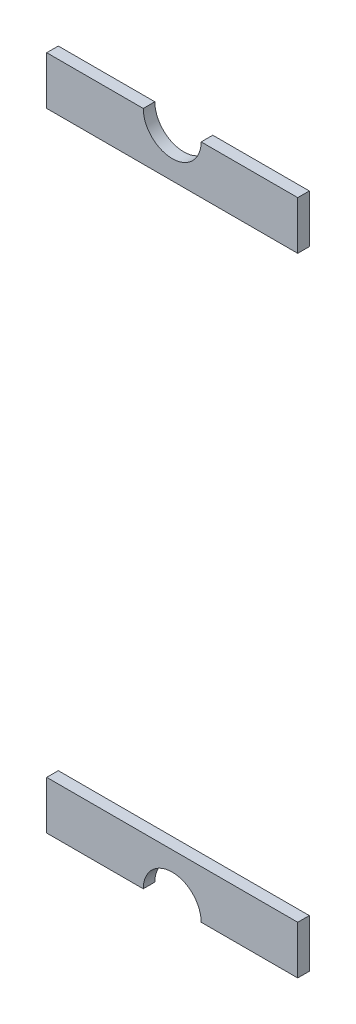
ISO-10303-21;
HEADER;
FILE_DESCRIPTION(('STEP AP214'),'2;1');
FILE_NAME('part.step','',(''),(''),'','','');
FILE_SCHEMA(('AUTOMOTIVE_DESIGN { 1 0 10303 214 1 1 1 1 }'));
ENDSEC;
DATA;
#1=APPLICATION_CONTEXT('core data for automotive mechanical design processes');
#2=APPLICATION_PROTOCOL_DEFINITION('international standard','automotive_design',2000,#1);
#3=PRODUCT_CONTEXT('',#1,'mechanical');
#4=PRODUCT('Part','Part','',(#3));
#5=PRODUCT_RELATED_PRODUCT_CATEGORY('part','',(#4));
#6=PRODUCT_DEFINITION_FORMATION('','',#4);
#7=PRODUCT_DEFINITION_CONTEXT('part definition',#1,'design');
#8=PRODUCT_DEFINITION('design','',#6,#7);
#9=PRODUCT_DEFINITION_SHAPE('','',#8);
#10=(LENGTH_UNIT() NAMED_UNIT(*) SI_UNIT(.MILLI.,.METRE.));
#11=(NAMED_UNIT(*) PLANE_ANGLE_UNIT() SI_UNIT($,.RADIAN.));
#12=(NAMED_UNIT(*) SI_UNIT($,.STERADIAN.) SOLID_ANGLE_UNIT());
#13=UNCERTAINTY_MEASURE_WITH_UNIT(LENGTH_MEASURE(1.E-05),#10,'distance_accuracy_value','');
#14=(GEOMETRIC_REPRESENTATION_CONTEXT(3) GLOBAL_UNCERTAINTY_ASSIGNED_CONTEXT((#13)) GLOBAL_UNIT_ASSIGNED_CONTEXT((#10,
#11,#12)) REPRESENTATION_CONTEXT('',''));
#15=CARTESIAN_POINT('',(0.,0.,0.));
#16=DIRECTION('',(0.,0.,1.));
#17=DIRECTION('',(1.,0.,0.));
#18=AXIS2_PLACEMENT_3D('',#15,#16,#17);
#19=CARTESIAN_POINT('',(-13.50000067937,19.12499934,0.12));
#20=DIRECTION('',(0.,0.,1.));
#21=DIRECTION('',(1.,0.,0.));
#22=AXIS2_PLACEMENT_3D('',#19,#20,#21);
#23=PLANE('',#22);
#24=DIRECTION('',(-1.,-1.19248806385E-08,0.));
#25=VECTOR('',#24,1.);
#26=CARTESIAN_POINT('',(-12.85000068086,19.249999347751,0.12));
#27=LINE('',#26,#25);
#28=CARTESIAN_POINT('',(-13.35000068086,19.2499993408943,0.12));
#29=VERTEX_POINT('',#28);
#30=CARTESIAN_POINT('',(-12.8500006808604,19.249999347751,0.12));
#31=VERTEX_POINT('',#30);
#32=EDGE_CURVE('P0_E48',#29,#31,#27,.F.);
#33=ORIENTED_EDGE('',*,*,#32,.F.);
#34=CARTESIAN_POINT('',(-13.50000068086,19.24999934,0.12));
#35=DIRECTION('',(0.,0.,1.));
#36=DIRECTION('',(1.,0.,0.));
#37=AXIS2_PLACEMENT_3D('',#34,#35,#36);
#38=CIRCLE('',#37,0.15);
#39=CARTESIAN_POINT('',(-13.65000068086,19.249999338211,0.12));
#40=VERTEX_POINT('',#39);
#41=EDGE_CURVE('P0_E20',#29,#40,#38,.F.);
#42=ORIENTED_EDGE('',*,*,#41,.T.);
#43=DIRECTION('',(-1.,-1.19248806385E-08,0.));
#44=VECTOR('',#43,1.);
#45=CARTESIAN_POINT('',(-13.65000068086,19.249999338211,0.12));
#46=LINE('',#45,#44);
#47=CARTESIAN_POINT('',(-14.15000068086,19.2499993322487,0.12));
#48=VERTEX_POINT('',#47);
#49=EDGE_CURVE('P0_E83',#48,#40,#46,.F.);
#50=ORIENTED_EDGE('',*,*,#49,.F.);
#51=DIRECTION('',(1.19248806385E-08,-1.,0.));
#52=VECTOR('',#51,1.);
#53=CARTESIAN_POINT('',(-14.15000068086,19.249999332249,0.12));
#54=LINE('',#53,#52);
#55=CARTESIAN_POINT('',(-14.1500006778796,18.999999332249,0.12));
#56=VERTEX_POINT('',#55);
#57=EDGE_CURVE('P0_E80',#56,#48,#54,.F.);
#58=ORIENTED_EDGE('',*,*,#57,.F.);
#59=DIRECTION('',(1.,1.19248806385E-08,0.));
#60=VECTOR('',#59,1.);
#61=CARTESIAN_POINT('',(-14.15000067788,18.999999332249,0.12));
#62=LINE('',#61,#60);
#63=CARTESIAN_POINT('',(-12.85000067788,18.9999993477511,0.12));
#64=VERTEX_POINT('',#63);
#65=EDGE_CURVE('P0_E71',#64,#56,#62,.F.);
#66=ORIENTED_EDGE('',*,*,#65,.F.);
#67=DIRECTION('',(-1.19248806385E-08,1.,0.));
#68=VECTOR('',#67,1.);
#69=CARTESIAN_POINT('',(-12.85000067788,18.999999347751,0.12));
#70=LINE('',#69,#68);
#71=EDGE_CURVE('P0_E92',#31,#64,#70,.F.);
#72=ORIENTED_EDGE('',*,*,#71,.F.);
#73=EDGE_LOOP('',(#33,#42,#50,#58,#66,#72));
#74=FACE_BOUND('',#73,.T.);
#75=ADVANCED_FACE('P0_F17',(#74),#23,.T.);
#76=CARTESIAN_POINT('',(-14.15000068086,19.249999332249,0.));
#77=DIRECTION('',(-1.,-1.19248806385E-08,0.));
#78=DIRECTION('',(1.19248806385E-08,-1.,0.));
#79=AXIS2_PLACEMENT_3D('',#76,#77,#78);
#80=PLANE('',#79);
#81=ORIENTED_EDGE('',*,*,#57,.T.);
#82=DIRECTION('',(0.,0.,1.));
#83=VECTOR('',#82,1.);
#84=CARTESIAN_POINT('',(-14.15000068086,19.2499993322486,0.));
#85=LINE('',#84,#83);
#86=CARTESIAN_POINT('',(-14.15000068086,19.2499993362235,0.06));
#87=VERTEX_POINT('',#86);
#88=EDGE_CURVE('P0_E102',#87,#48,#85,.T.);
#89=ORIENTED_EDGE('',*,*,#88,.F.);
#90=DIRECTION('',(0.,1.,0.));
#91=VECTOR('',#90,1.);
#92=CARTESIAN_POINT('',(-14.15000068086,19.12499934,0.06));
#93=LINE('',#92,#91);
#94=CARTESIAN_POINT('',(-14.1500006798667,18.999999332249,0.06));
#95=VERTEX_POINT('',#94);
#96=EDGE_CURVE('P0_E91',#87,#95,#93,.F.);
#97=ORIENTED_EDGE('',*,*,#96,.T.);
#98=DIRECTION('',(0.,0.,1.));
#99=VECTOR('',#98,1.);
#100=CARTESIAN_POINT('',(-14.15000067788,18.999999332249,0.));
#101=LINE('',#100,#99);
#102=EDGE_CURVE('P0_E76',#56,#95,#101,.F.);
#103=ORIENTED_EDGE('',*,*,#102,.F.);
#104=EDGE_LOOP('',(#81,#89,#97,#103));
#105=FACE_BOUND('',#104,.T.);
#106=ADVANCED_FACE('P0_F89',(#105),#80,.T.);
#107=CARTESIAN_POINT('',(-14.15000067788,18.999999332249,0.));
#108=DIRECTION('',(1.19248806385E-08,-1.,0.));
#109=DIRECTION('',(1.,1.19248806385E-08,0.));
#110=AXIS2_PLACEMENT_3D('',#107,#108,#109);
#111=PLANE('',#110);
#112=ORIENTED_EDGE('',*,*,#65,.T.);
#113=ORIENTED_EDGE('',*,*,#102,.T.);
#114=DIRECTION('',(1.,0.,0.));
#115=VECTOR('',#114,1.);
#116=CARTESIAN_POINT('',(-13.50000067937,18.999999332249,0.06));
#117=LINE('',#116,#115);
#118=CARTESIAN_POINT('',(-12.85000067788,18.9999993374163,0.06));
#119=VERTEX_POINT('',#118);
#120=EDGE_CURVE('P0_E123',#95,#119,#117,.T.);
#121=ORIENTED_EDGE('',*,*,#120,.T.);
#122=DIRECTION('',(0.,0.,1.));
#123=VECTOR('',#122,1.);
#124=CARTESIAN_POINT('',(-12.85000067788,18.999999347751,0.));
#125=LINE('',#124,#123);
#126=EDGE_CURVE('P0_E79',#64,#119,#125,.F.);
#127=ORIENTED_EDGE('',*,*,#126,.F.);
#128=EDGE_LOOP('',(#112,#113,#121,#127));
#129=FACE_BOUND('',#128,.T.);
#130=ADVANCED_FACE('P0_F73',(#129),#111,.T.);
#131=CARTESIAN_POINT('',(-12.85000067788,18.999999347751,0.));
#132=DIRECTION('',(1.,1.19248806385E-08,0.));
#133=DIRECTION('',(-1.19248806385E-08,1.,0.));
#134=AXIS2_PLACEMENT_3D('',#131,#132,#133);
#135=PLANE('',#134);
#136=ORIENTED_EDGE('',*,*,#71,.T.);
#137=ORIENTED_EDGE('',*,*,#126,.T.);
#138=DIRECTION('',(0.,1.,0.));
#139=VECTOR('',#138,1.);
#140=CARTESIAN_POINT('',(-12.85000067788,19.12499934,0.06));
#141=LINE('',#140,#139);
#142=CARTESIAN_POINT('',(-12.8500006788733,19.249999347751,0.06));
#143=VERTEX_POINT('',#142);
#144=EDGE_CURVE('P0_E119',#119,#143,#141,.T.);
#145=ORIENTED_EDGE('',*,*,#144,.T.);
#146=DIRECTION('',(0.,0.,1.));
#147=VECTOR('',#146,1.);
#148=CARTESIAN_POINT('',(-12.85000068086,19.249999347751,0.));
#149=LINE('',#148,#147);
#150=EDGE_CURVE('P0_E108',#31,#143,#149,.F.);
#151=ORIENTED_EDGE('',*,*,#150,.F.);
#152=EDGE_LOOP('',(#136,#137,#145,#151));
#153=FACE_BOUND('',#152,.T.);
#154=ADVANCED_FACE('P0_F151',(#153),#135,.T.);
#155=CARTESIAN_POINT('',(-12.85000068086,19.249999347751,0.));
#156=DIRECTION('',(-1.19248806385E-08,1.,0.));
#157=DIRECTION('',(-1.,-1.19248806385E-08,0.));
#158=AXIS2_PLACEMENT_3D('',#155,#156,#157);
#159=PLANE('',#158);
#160=ORIENTED_EDGE('',*,*,#32,.T.);
#161=ORIENTED_EDGE('',*,*,#150,.T.);
#162=DIRECTION('',(1.,0.,0.));
#163=VECTOR('',#162,1.);
#164=CARTESIAN_POINT('',(-13.50000067937,19.249999347751,0.06));
#165=LINE('',#164,#163);
#166=CARTESIAN_POINT('',(-13.35000068086,19.2499993438755,0.06));
#167=VERTEX_POINT('',#166);
#168=EDGE_CURVE('P0_E115',#143,#167,#165,.F.);
#169=ORIENTED_EDGE('',*,*,#168,.T.);
#170=DIRECTION('',(0.,0.,1.));
#171=VECTOR('',#170,1.);
#172=CARTESIAN_POINT('',(-13.35000068086,19.24999934,0.));
#173=LINE('',#172,#171);
#174=EDGE_CURVE('P0_E137',#167,#29,#173,.T.);
#175=ORIENTED_EDGE('',*,*,#174,.T.);
#176=EDGE_LOOP('',(#160,#161,#169,#175));
#177=FACE_BOUND('',#176,.T.);
#178=ADVANCED_FACE('P0_F156',(#177),#159,.T.);
#179=CARTESIAN_POINT('',(-13.50000068086,19.24999934,0.));
#180=DIRECTION('',(0.,0.,1.));
#181=DIRECTION('',(1.,0.,0.));
#182=AXIS2_PLACEMENT_3D('',#179,#180,#181);
#183=CYLINDRICAL_SURFACE('',#182,0.15);
#184=DIRECTION('',(0.,0.,1.));
#185=VECTOR('',#184,1.);
#186=CARTESIAN_POINT('',(-13.65000068086,19.249999338211,0.));
#187=LINE('',#186,#185);
#188=CARTESIAN_POINT('',(-13.65000068086,19.249999338211,0.06));
#189=VERTEX_POINT('',#188);
#190=EDGE_CURVE('P0_E34',#40,#189,#187,.F.);
#191=ORIENTED_EDGE('',*,*,#190,.F.);
#192=ORIENTED_EDGE('',*,*,#41,.F.);
#193=ORIENTED_EDGE('',*,*,#174,.F.);
#194=CARTESIAN_POINT('',(-13.50000068086,19.24999934,0.06));
#195=DIRECTION('',(0.,0.,1.));
#196=DIRECTION('',(1.,0.,0.));
#197=AXIS2_PLACEMENT_3D('',#194,#195,#196);
#198=CIRCLE('',#197,0.15);
#199=EDGE_CURVE('P0_E26',#167,#189,#198,.F.);
#200=ORIENTED_EDGE('',*,*,#199,.T.);
#201=EDGE_LOOP('',(#191,#192,#193,#200));
#202=FACE_BOUND('',#201,.T.);
#203=ADVANCED_FACE('P0_F154',(#202),#183,.F.);
#204=CARTESIAN_POINT('',(-13.65000068086,19.249999338211,0.));
#205=DIRECTION('',(-1.19248806385E-08,1.,0.));
#206=DIRECTION('',(-1.,-1.19248806385E-08,0.));
#207=AXIS2_PLACEMENT_3D('',#204,#205,#206);
#208=PLANE('',#207);
#209=ORIENTED_EDGE('',*,*,#49,.T.);
#210=ORIENTED_EDGE('',*,*,#190,.T.);
#211=DIRECTION('',(1.,0.,0.));
#212=VECTOR('',#211,1.);
#213=CARTESIAN_POINT('',(-13.50000067937,19.249999338211,0.06));
#214=LINE('',#213,#212);
#215=EDGE_CURVE('P0_E11',#189,#87,#214,.F.);
#216=ORIENTED_EDGE('',*,*,#215,.T.);
#217=ORIENTED_EDGE('',*,*,#88,.T.);
#218=EDGE_LOOP('',(#209,#210,#216,#217));
#219=FACE_BOUND('',#218,.T.);
#220=ADVANCED_FACE('P0_F153',(#219),#208,.T.);
#221=CARTESIAN_POINT('',(-13.50000067937,19.12499934,0.06));
#222=DIRECTION('',(0.,0.,1.));
#223=DIRECTION('',(1.,0.,0.));
#224=AXIS2_PLACEMENT_3D('',#221,#222,#223);
#225=PLANE('',#224);
#226=ORIENTED_EDGE('',*,*,#199,.F.);
#227=ORIENTED_EDGE('',*,*,#168,.F.);
#228=ORIENTED_EDGE('',*,*,#144,.F.);
#229=ORIENTED_EDGE('',*,*,#120,.F.);
#230=ORIENTED_EDGE('',*,*,#96,.F.);
#231=ORIENTED_EDGE('',*,*,#215,.F.);
#232=EDGE_LOOP('',(#226,#227,#228,#229,#230,#231));
#233=FACE_BOUND('',#232,.T.);
#234=ADVANCED_FACE('P0_F148',(#233),#225,.F.);
#235=CLOSED_SHELL('',(#75,#106,#130,#154,#178,#203,#220,#234));
#236=MANIFOLD_SOLID_BREP('P0_B1',#235);
#237=CARTESIAN_POINT('',(-13.50000064062,15.87499934,0.06));
#238=DIRECTION('',(0.,0.,1.));
#239=DIRECTION('',(1.,0.,0.));
#240=AXIS2_PLACEMENT_3D('',#237,#238,#239);
#241=PLANE('',#240);
#242=CARTESIAN_POINT('',(-13.50000063913,15.74999934,0.06));
#243=DIRECTION('',(0.,0.,1.));
#244=DIRECTION('',(1.,0.,0.));
#245=AXIS2_PLACEMENT_3D('',#242,#243,#244);
#246=CIRCLE('',#245,0.15);
#247=CARTESIAN_POINT('',(-13.35000063913,15.7499993408945,0.06));
#248=VERTEX_POINT('',#247);
#249=CARTESIAN_POINT('',(-13.65000063913,15.7499993382112,0.06));
#250=VERTEX_POINT('',#249);
#251=EDGE_CURVE('P1_E20',#248,#250,#246,.T.);
#252=ORIENTED_EDGE('',*,*,#251,.T.);
#253=DIRECTION('',(1.,1.19248806385E-08,0.));
#254=VECTOR('',#253,1.);
#255=CARTESIAN_POINT('',(-14.15000063913,15.749999332249,0.06));
#256=LINE('',#255,#254);
#257=CARTESIAN_POINT('',(-14.1500006391296,15.749999332249,0.06));
#258=VERTEX_POINT('',#257);
#259=EDGE_CURVE('P1_E57',#258,#250,#256,.T.);
#260=ORIENTED_EDGE('',*,*,#259,.F.);
#261=DIRECTION('',(1.19248806385E-08,-1.,0.));
#262=VECTOR('',#261,1.);
#263=CARTESIAN_POINT('',(-14.15000064211,15.999999332249,0.06));
#264=LINE('',#263,#262);
#265=CARTESIAN_POINT('',(-14.15000064211,15.9999993322489,0.06));
#266=VERTEX_POINT('',#265);
#267=EDGE_CURVE('P1_E107',#266,#258,#264,.T.);
#268=ORIENTED_EDGE('',*,*,#267,.F.);
#269=DIRECTION('',(-1.,-1.19248806385E-08,0.));
#270=VECTOR('',#269,1.);
#271=CARTESIAN_POINT('',(-12.85000064211,15.999999347751,0.06));
#272=LINE('',#271,#270);
#273=CARTESIAN_POINT('',(-12.8500006421104,15.999999347751,0.06));
#274=VERTEX_POINT('',#273);
#275=EDGE_CURVE('P1_E72',#274,#266,#272,.T.);
#276=ORIENTED_EDGE('',*,*,#275,.F.);
#277=DIRECTION('',(-1.19248806385E-08,1.,0.));
#278=VECTOR('',#277,1.);
#279=CARTESIAN_POINT('',(-12.85000063913,15.749999347751,0.06));
#280=LINE('',#279,#278);
#281=CARTESIAN_POINT('',(-12.85000063913,15.7499993477511,0.06));
#282=VERTEX_POINT('',#281);
#283=EDGE_CURVE('P1_E74',#282,#274,#280,.T.);
#284=ORIENTED_EDGE('',*,*,#283,.F.);
#285=DIRECTION('',(1.,1.19248806385E-08,0.));
#286=VECTOR('',#285,1.);
#287=CARTESIAN_POINT('',(-13.35000063913,15.749999341789,0.06));
#288=LINE('',#287,#286);
#289=EDGE_CURVE('P1_E52',#248,#282,#288,.T.);
#290=ORIENTED_EDGE('',*,*,#289,.F.);
#291=EDGE_LOOP('',(#252,#260,#268,#276,#284,#290));
#292=FACE_BOUND('',#291,.T.);
#293=ADVANCED_FACE('P1_F17',(#292),#241,.F.);
#294=CARTESIAN_POINT('',(-13.35000063913,15.749999341789,0.));
#295=DIRECTION('',(1.19248806385E-08,-1.,0.));
#296=DIRECTION('',(1.,1.19248806385E-08,0.));
#297=AXIS2_PLACEMENT_3D('',#294,#295,#296);
#298=PLANE('',#297);
#299=DIRECTION('',(1.,0.,0.));
#300=VECTOR('',#299,1.);
#301=CARTESIAN_POINT('',(-13.50000064062,15.749999341789,0.12));
#302=LINE('',#301,#300);
#303=CARTESIAN_POINT('',(-13.35000063913,15.7499993408945,0.12));
#304=VERTEX_POINT('',#303);
#305=CARTESIAN_POINT('',(-12.85000063913,15.7499993437763,0.12));
#306=VERTEX_POINT('',#305);
#307=EDGE_CURVE('P1_E126',#304,#306,#302,.T.);
#308=ORIENTED_EDGE('',*,*,#307,.F.);
#309=DIRECTION('',(0.,0.,1.));
#310=VECTOR('',#309,1.);
#311=CARTESIAN_POINT('',(-13.35000063913,15.74999934,0.));
#312=LINE('',#311,#310);
#313=EDGE_CURVE('P1_E84',#304,#248,#312,.F.);
#314=ORIENTED_EDGE('',*,*,#313,.T.);
#315=ORIENTED_EDGE('',*,*,#289,.T.);
#316=DIRECTION('',(0.,0.,1.));
#317=VECTOR('',#316,1.);
#318=CARTESIAN_POINT('',(-12.85000063913,15.749999347751,0.));
#319=LINE('',#318,#317);
#320=EDGE_CURVE('P1_E78',#306,#282,#319,.F.);
#321=ORIENTED_EDGE('',*,*,#320,.F.);
#322=EDGE_LOOP('',(#308,#314,#315,#321));
#323=FACE_BOUND('',#322,.T.);
#324=ADVANCED_FACE('P1_F81',(#323),#298,.T.);
#325=CARTESIAN_POINT('',(-12.85000063913,15.749999347751,0.));
#326=DIRECTION('',(1.,1.19248806385E-08,0.));
#327=DIRECTION('',(-1.19248806385E-08,1.,0.));
#328=AXIS2_PLACEMENT_3D('',#325,#326,#327);
#329=PLANE('',#328);
#330=DIRECTION('',(0.,1.,0.));
#331=VECTOR('',#330,1.);
#332=CARTESIAN_POINT('',(-12.85000063913,15.87499934,0.12));
#333=LINE('',#332,#331);
#334=CARTESIAN_POINT('',(-12.8500006401233,15.999999347751,0.12));
#335=VERTEX_POINT('',#334);
#336=EDGE_CURVE('P1_E89',#306,#335,#333,.T.);
#337=ORIENTED_EDGE('',*,*,#336,.F.);
#338=ORIENTED_EDGE('',*,*,#320,.T.);
#339=ORIENTED_EDGE('',*,*,#283,.T.);
#340=DIRECTION('',(0.,0.,1.));
#341=VECTOR('',#340,1.);
#342=CARTESIAN_POINT('',(-12.85000064211,15.999999347751,0.));
#343=LINE('',#342,#341);
#344=EDGE_CURVE('P1_E92',#335,#274,#343,.F.);
#345=ORIENTED_EDGE('',*,*,#344,.F.);
#346=EDGE_LOOP('',(#337,#338,#339,#345));
#347=FACE_BOUND('',#346,.T.);
#348=ADVANCED_FACE('P1_F87',(#347),#329,.T.);
#349=CARTESIAN_POINT('',(-12.85000064211,15.999999347751,0.));
#350=DIRECTION('',(-1.19248806385E-08,1.,0.));
#351=DIRECTION('',(-1.,-1.19248806385E-08,0.));
#352=AXIS2_PLACEMENT_3D('',#349,#350,#351);
#353=PLANE('',#352);
#354=DIRECTION('',(1.,0.,0.));
#355=VECTOR('',#354,1.);
#356=CARTESIAN_POINT('',(-13.50000064062,15.999999347751,0.12));
#357=LINE('',#356,#355);
#358=CARTESIAN_POINT('',(-14.15000064211,15.9999993425837,0.12));
#359=VERTEX_POINT('',#358);
#360=EDGE_CURVE('P1_E125',#335,#359,#357,.F.);
#361=ORIENTED_EDGE('',*,*,#360,.F.);
#362=ORIENTED_EDGE('',*,*,#344,.T.);
#363=ORIENTED_EDGE('',*,*,#275,.T.);
#364=DIRECTION('',(0.,0.,1.));
#365=VECTOR('',#364,1.);
#366=CARTESIAN_POINT('',(-14.15000064211,15.999999332249,0.));
#367=LINE('',#366,#365);
#368=EDGE_CURVE('P1_E104',#359,#266,#367,.F.);
#369=ORIENTED_EDGE('',*,*,#368,.F.);
#370=EDGE_LOOP('',(#361,#362,#363,#369));
#371=FACE_BOUND('',#370,.T.);
#372=ADVANCED_FACE('P1_F153',(#371),#353,.T.);
#373=CARTESIAN_POINT('',(-14.15000064211,15.999999332249,0.));
#374=DIRECTION('',(-1.,-1.19248806385E-08,0.));
#375=DIRECTION('',(1.19248806385E-08,-1.,0.));
#376=AXIS2_PLACEMENT_3D('',#373,#374,#375);
#377=PLANE('',#376);
#378=DIRECTION('',(0.,1.,0.));
#379=VECTOR('',#378,1.);
#380=CARTESIAN_POINT('',(-14.15000064211,15.87499934,0.12));
#381=LINE('',#380,#379);
#382=CARTESIAN_POINT('',(-14.1500006411167,15.749999332249,0.12));
#383=VERTEX_POINT('',#382);
#384=EDGE_CURVE('P1_E129',#359,#383,#381,.F.);
#385=ORIENTED_EDGE('',*,*,#384,.F.);
#386=ORIENTED_EDGE('',*,*,#368,.T.);
#387=ORIENTED_EDGE('',*,*,#267,.T.);
#388=DIRECTION('',(0.,0.,1.));
#389=VECTOR('',#388,1.);
#390=CARTESIAN_POINT('',(-14.15000063913,15.749999332249,0.));
#391=LINE('',#390,#389);
#392=EDGE_CURVE('P1_E103',#383,#258,#391,.F.);
#393=ORIENTED_EDGE('',*,*,#392,.F.);
#394=EDGE_LOOP('',(#385,#386,#387,#393));
#395=FACE_BOUND('',#394,.T.);
#396=ADVANCED_FACE('P1_F151',(#395),#377,.T.);
#397=CARTESIAN_POINT('',(-14.15000063913,15.749999332249,0.));
#398=DIRECTION('',(1.19248806385E-08,-1.,0.));
#399=DIRECTION('',(1.,1.19248806385E-08,0.));
#400=AXIS2_PLACEMENT_3D('',#397,#398,#399);
#401=PLANE('',#400);
#402=DIRECTION('',(1.,0.,0.));
#403=VECTOR('',#402,1.);
#404=CARTESIAN_POINT('',(-13.50000064062,15.749999332249,0.12));
#405=LINE('',#404,#403);
#406=CARTESIAN_POINT('',(-13.65000063913,15.74999933523,0.12));
#407=VERTEX_POINT('',#406);
#408=EDGE_CURVE('P1_E26',#383,#407,#405,.T.);
#409=ORIENTED_EDGE('',*,*,#408,.F.);
#410=ORIENTED_EDGE('',*,*,#392,.T.);
#411=ORIENTED_EDGE('',*,*,#259,.T.);
#412=DIRECTION('',(0.,0.,1.));
#413=VECTOR('',#412,1.);
#414=CARTESIAN_POINT('',(-13.65000063913,15.749999338211,0.));
#415=LINE('',#414,#413);
#416=EDGE_CURVE('P1_E34',#250,#407,#415,.T.);
#417=ORIENTED_EDGE('',*,*,#416,.T.);
#418=EDGE_LOOP('',(#409,#410,#411,#417));
#419=FACE_BOUND('',#418,.T.);
#420=ADVANCED_FACE('P1_F150',(#419),#401,.T.);
#421=CARTESIAN_POINT('',(-13.50000063913,15.74999934,0.));
#422=DIRECTION('',(0.,0.,1.));
#423=DIRECTION('',(1.,0.,0.));
#424=AXIS2_PLACEMENT_3D('',#421,#422,#423);
#425=CYLINDRICAL_SURFACE('',#424,0.15);
#426=ORIENTED_EDGE('',*,*,#313,.F.);
#427=CARTESIAN_POINT('',(-13.50000063913,15.74999934,0.12));
#428=DIRECTION('',(0.,0.,1.));
#429=DIRECTION('',(1.,0.,0.));
#430=AXIS2_PLACEMENT_3D('',#427,#428,#429);
#431=CIRCLE('',#430,0.15);
#432=EDGE_CURVE('P1_E11',#407,#304,#431,.F.);
#433=ORIENTED_EDGE('',*,*,#432,.F.);
#434=ORIENTED_EDGE('',*,*,#416,.F.);
#435=ORIENTED_EDGE('',*,*,#251,.F.);
#436=EDGE_LOOP('',(#426,#433,#434,#435));
#437=FACE_BOUND('',#436,.T.);
#438=ADVANCED_FACE('P1_F164',(#437),#425,.F.);
#439=CARTESIAN_POINT('',(-13.50000064062,15.87499934,0.12));
#440=DIRECTION('',(0.,0.,1.));
#441=DIRECTION('',(1.,0.,0.));
#442=AXIS2_PLACEMENT_3D('',#439,#440,#441);
#443=PLANE('',#442);
#444=ORIENTED_EDGE('',*,*,#408,.T.);
#445=ORIENTED_EDGE('',*,*,#432,.T.);
#446=ORIENTED_EDGE('',*,*,#307,.T.);
#447=ORIENTED_EDGE('',*,*,#336,.T.);
#448=ORIENTED_EDGE('',*,*,#360,.T.);
#449=ORIENTED_EDGE('',*,*,#384,.T.);
#450=EDGE_LOOP('',(#444,#445,#446,#447,#448,#449));
#451=FACE_BOUND('',#450,.T.);
#452=ADVANCED_FACE('P1_F149',(#451),#443,.T.);
#453=CLOSED_SHELL('',(#293,#324,#348,#372,#396,#420,#438,#452));
#454=MANIFOLD_SOLID_BREP('P1_B1',#453);
#455=ADVANCED_BREP_SHAPE_REPRESENTATION('',(#18,#236,#454),#14);
#456=SHAPE_DEFINITION_REPRESENTATION(#9,#455);
ENDSEC;
END-ISO-10303-21;
